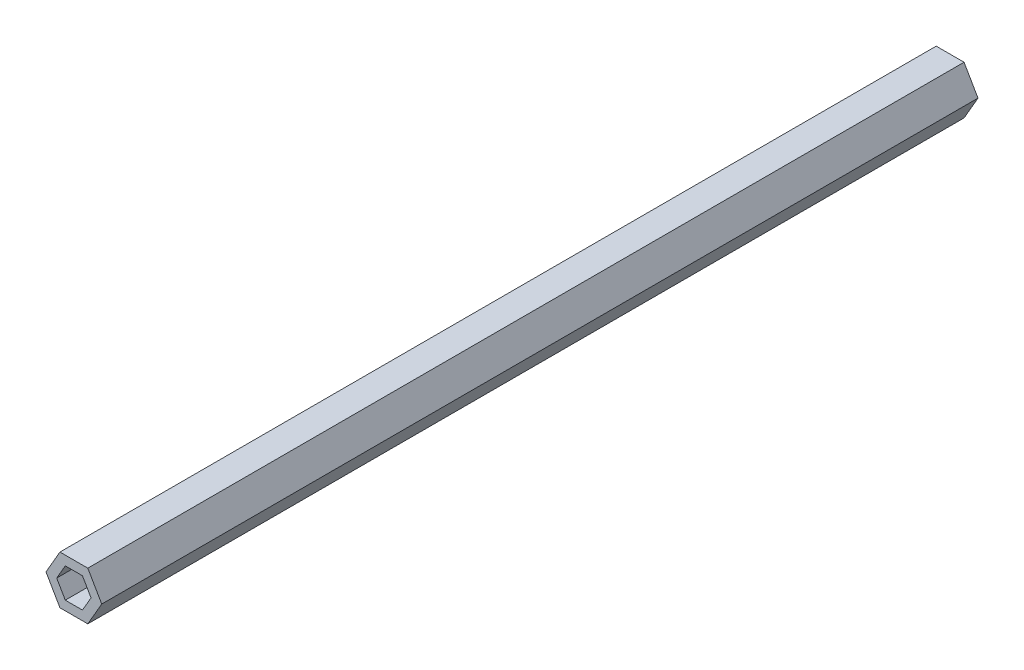
ISO-10303-21;
HEADER;
FILE_DESCRIPTION(('STEP AP214'),'2;1');
FILE_NAME('part.step','',(''),(''),'','','');
FILE_SCHEMA(('AUTOMOTIVE_DESIGN { 1 0 10303 214 1 1 1 1 }'));
ENDSEC;
DATA;
#1=APPLICATION_CONTEXT('core data for automotive mechanical design processes');
#2=APPLICATION_PROTOCOL_DEFINITION('international standard','automotive_design',2000,#1);
#3=PRODUCT_CONTEXT('',#1,'mechanical');
#4=PRODUCT('Part','Part','',(#3));
#5=PRODUCT_RELATED_PRODUCT_CATEGORY('part','',(#4));
#6=PRODUCT_DEFINITION_FORMATION('','',#4);
#7=PRODUCT_DEFINITION_CONTEXT('part definition',#1,'design');
#8=PRODUCT_DEFINITION('design','',#6,#7);
#9=PRODUCT_DEFINITION_SHAPE('','',#8);
#10=(LENGTH_UNIT() NAMED_UNIT(*) SI_UNIT(.MILLI.,.METRE.));
#11=(NAMED_UNIT(*) PLANE_ANGLE_UNIT() SI_UNIT($,.RADIAN.));
#12=(NAMED_UNIT(*) SI_UNIT($,.STERADIAN.) SOLID_ANGLE_UNIT());
#13=UNCERTAINTY_MEASURE_WITH_UNIT(LENGTH_MEASURE(1.E-05),#10,'distance_accuracy_value','');
#14=(GEOMETRIC_REPRESENTATION_CONTEXT(3) GLOBAL_UNCERTAINTY_ASSIGNED_CONTEXT((#13)) GLOBAL_UNIT_ASSIGNED_CONTEXT((#10,
#11,#12)) REPRESENTATION_CONTEXT('',''));
#15=CARTESIAN_POINT('',(0.,0.,0.));
#16=DIRECTION('',(0.,0.,1.));
#17=DIRECTION('',(1.,0.,0.));
#18=AXIS2_PLACEMENT_3D('',#15,#16,#17);
#19=CARTESIAN_POINT('',(2.8575,-4.94933518262807,179.705));
#20=DIRECTION('',(-0.866025403784439,0.5,0.));
#21=DIRECTION('',(-0.5,-0.866025403784439,0.));
#22=AXIS2_PLACEMENT_3D('',#19,#20,#21);
#23=PLANE('',#22);
#24=DIRECTION('',(0.5,0.866025403784439,0.));
#25=VECTOR('',#24,1.);
#26=CARTESIAN_POINT('',(2.8575,-4.94933518262807,0.));
#27=LINE('',#26,#25);
#28=CARTESIAN_POINT('',(2.8575,-4.94933518262807,0.));
#29=VERTEX_POINT('',#28);
#30=CARTESIAN_POINT('',(5.715,0.,0.));
#31=VERTEX_POINT('',#30);
#32=EDGE_CURVE('E298',#29,#31,#27,.T.);
#33=ORIENTED_EDGE('',*,*,#32,.T.);
#34=DIRECTION('',(0.,0.,-1.));
#35=VECTOR('',#34,1.);
#36=CARTESIAN_POINT('',(5.715,0.,179.705));
#37=LINE('',#36,#35);
#38=CARTESIAN_POINT('',(5.715,0.,179.705));
#39=VERTEX_POINT('',#38);
#40=EDGE_CURVE('E11',#39,#31,#37,.T.);
#41=ORIENTED_EDGE('',*,*,#40,.F.);
#42=DIRECTION('',(0.5,0.866025403784439,0.));
#43=VECTOR('',#42,1.);
#44=CARTESIAN_POINT('',(2.8575,-4.94933518262807,179.705));
#45=LINE('',#44,#43);
#46=CARTESIAN_POINT('',(2.8575,-4.94933518262807,179.705));
#47=VERTEX_POINT('',#46);
#48=EDGE_CURVE('E313',#47,#39,#45,.T.);
#49=ORIENTED_EDGE('',*,*,#48,.F.);
#50=DIRECTION('',(0.,0.,-1.));
#51=VECTOR('',#50,1.);
#52=CARTESIAN_POINT('',(2.8575,-4.94933518262807,179.705));
#53=LINE('',#52,#51);
#54=EDGE_CURVE('E333',#47,#29,#53,.T.);
#55=ORIENTED_EDGE('',*,*,#54,.T.);
#56=EDGE_LOOP('',(#33,#41,#49,#55));
#57=FACE_BOUND('',#56,.T.);
#58=ADVANCED_FACE('F49',(#57),#23,.F.);
#59=CARTESIAN_POINT('',(5.715,0.,179.705));
#60=DIRECTION('',(-0.866025403784438,-0.5,0.));
#61=DIRECTION('',(0.500000000000001,-0.866025403784438,0.));
#62=AXIS2_PLACEMENT_3D('',#59,#60,#61);
#63=PLANE('',#62);
#64=DIRECTION('',(-0.500000000000001,0.866025403784438,0.));
#65=VECTOR('',#64,1.);
#66=CARTESIAN_POINT('',(5.715,0.,0.));
#67=LINE('',#66,#65);
#68=CARTESIAN_POINT('',(2.8575,4.94933518262807,0.));
#69=VERTEX_POINT('',#68);
#70=EDGE_CURVE('E337',#31,#69,#67,.T.);
#71=ORIENTED_EDGE('',*,*,#70,.T.);
#72=DIRECTION('',(0.,0.,-1.));
#73=VECTOR('',#72,1.);
#74=CARTESIAN_POINT('',(2.8575,4.94933518262807,179.705));
#75=LINE('',#74,#73);
#76=CARTESIAN_POINT('',(2.8575,4.94933518262807,179.705));
#77=VERTEX_POINT('',#76);
#78=EDGE_CURVE('E57',#77,#69,#75,.T.);
#79=ORIENTED_EDGE('',*,*,#78,.F.);
#80=DIRECTION('',(-0.500000000000001,0.866025403784438,0.));
#81=VECTOR('',#80,1.);
#82=CARTESIAN_POINT('',(5.715,0.,179.705));
#83=LINE('',#82,#81);
#84=EDGE_CURVE('E317',#39,#77,#83,.T.);
#85=ORIENTED_EDGE('',*,*,#84,.F.);
#86=ORIENTED_EDGE('',*,*,#40,.T.);
#87=EDGE_LOOP('',(#71,#79,#85,#86));
#88=FACE_BOUND('',#87,.T.);
#89=ADVANCED_FACE('F394',(#88),#63,.F.);
#90=CARTESIAN_POINT('',(2.8575,4.94933518262807,179.705));
#91=DIRECTION('',(0.,-1.,0.));
#92=DIRECTION('',(1.,0.,0.));
#93=AXIS2_PLACEMENT_3D('',#90,#91,#92);
#94=PLANE('',#93);
#95=DIRECTION('',(-1.,0.,0.));
#96=VECTOR('',#95,1.);
#97=CARTESIAN_POINT('',(2.8575,4.94933518262807,0.));
#98=LINE('',#97,#96);
#99=CARTESIAN_POINT('',(-2.8575,4.94933518262807,0.));
#100=VERTEX_POINT('',#99);
#101=EDGE_CURVE('E339',#69,#100,#98,.T.);
#102=ORIENTED_EDGE('',*,*,#101,.T.);
#103=DIRECTION('',(0.,0.,-1.));
#104=VECTOR('',#103,1.);
#105=CARTESIAN_POINT('',(-2.8575,4.94933518262807,179.705));
#106=LINE('',#105,#104);
#107=CARTESIAN_POINT('',(-2.8575,4.94933518262807,179.705));
#108=VERTEX_POINT('',#107);
#109=EDGE_CURVE('E361',#108,#100,#106,.T.);
#110=ORIENTED_EDGE('',*,*,#109,.F.);
#111=DIRECTION('',(-1.,0.,0.));
#112=VECTOR('',#111,1.);
#113=CARTESIAN_POINT('',(2.8575,4.94933518262807,179.705));
#114=LINE('',#113,#112);
#115=EDGE_CURVE('E321',#77,#108,#114,.T.);
#116=ORIENTED_EDGE('',*,*,#115,.F.);
#117=ORIENTED_EDGE('',*,*,#78,.T.);
#118=EDGE_LOOP('',(#102,#110,#116,#117));
#119=FACE_BOUND('',#118,.T.);
#120=ADVANCED_FACE('F371',(#119),#94,.F.);
#121=CARTESIAN_POINT('',(-2.8575,4.94933518262807,179.705));
#122=DIRECTION('',(0.866025403784439,-0.5,0.));
#123=DIRECTION('',(0.5,0.866025403784439,0.));
#124=AXIS2_PLACEMENT_3D('',#121,#122,#123);
#125=PLANE('',#124);
#126=DIRECTION('',(-0.5,-0.866025403784439,0.));
#127=VECTOR('',#126,1.);
#128=CARTESIAN_POINT('',(-2.8575,4.94933518262807,0.));
#129=LINE('',#128,#127);
#130=CARTESIAN_POINT('',(-5.715,0.,0.));
#131=VERTEX_POINT('',#130);
#132=EDGE_CURVE('E342',#100,#131,#129,.T.);
#133=ORIENTED_EDGE('',*,*,#132,.T.);
#134=DIRECTION('',(0.,0.,-1.));
#135=VECTOR('',#134,1.);
#136=CARTESIAN_POINT('',(-5.715,0.,179.705));
#137=LINE('',#136,#135);
#138=CARTESIAN_POINT('',(-5.715,0.,179.705));
#139=VERTEX_POINT('',#138);
#140=EDGE_CURVE('E357',#139,#131,#137,.T.);
#141=ORIENTED_EDGE('',*,*,#140,.F.);
#142=DIRECTION('',(-0.5,-0.866025403784439,0.));
#143=VECTOR('',#142,1.);
#144=CARTESIAN_POINT('',(-2.8575,4.94933518262807,179.705));
#145=LINE('',#144,#143);
#146=EDGE_CURVE('E324',#108,#139,#145,.T.);
#147=ORIENTED_EDGE('',*,*,#146,.F.);
#148=ORIENTED_EDGE('',*,*,#109,.T.);
#149=EDGE_LOOP('',(#133,#141,#147,#148));
#150=FACE_BOUND('',#149,.T.);
#151=ADVANCED_FACE('F382',(#150),#125,.F.);
#152=CARTESIAN_POINT('',(-5.715,0.,179.705));
#153=DIRECTION('',(0.866025403784438,0.5,0.));
#154=DIRECTION('',(-0.5,0.866025403784439,0.));
#155=AXIS2_PLACEMENT_3D('',#152,#153,#154);
#156=PLANE('',#155);
#157=DIRECTION('',(0.5,-0.866025403784438,0.));
#158=VECTOR('',#157,1.);
#159=CARTESIAN_POINT('',(-5.715,0.,0.));
#160=LINE('',#159,#158);
#161=CARTESIAN_POINT('',(-2.8575,-4.94933518262807,0.));
#162=VERTEX_POINT('',#161);
#163=EDGE_CURVE('E345',#131,#162,#160,.T.);
#164=ORIENTED_EDGE('',*,*,#163,.T.);
#165=DIRECTION('',(0.,0.,-1.));
#166=VECTOR('',#165,1.);
#167=CARTESIAN_POINT('',(-2.8575,-4.94933518262807,179.705));
#168=LINE('',#167,#166);
#169=CARTESIAN_POINT('',(-2.8575,-4.94933518262807,179.705));
#170=VERTEX_POINT('',#169);
#171=EDGE_CURVE('E353',#170,#162,#168,.T.);
#172=ORIENTED_EDGE('',*,*,#171,.F.);
#173=DIRECTION('',(0.5,-0.866025403784438,0.));
#174=VECTOR('',#173,1.);
#175=CARTESIAN_POINT('',(-5.715,0.,179.705));
#176=LINE('',#175,#174);
#177=EDGE_CURVE('E327',#139,#170,#176,.T.);
#178=ORIENTED_EDGE('',*,*,#177,.F.);
#179=ORIENTED_EDGE('',*,*,#140,.T.);
#180=EDGE_LOOP('',(#164,#172,#178,#179));
#181=FACE_BOUND('',#180,.T.);
#182=ADVANCED_FACE('F386',(#181),#156,.F.);
#183=CARTESIAN_POINT('',(-2.8575,-4.94933518262807,179.705));
#184=DIRECTION('',(0.,1.,0.));
#185=DIRECTION('',(-1.,0.,0.));
#186=AXIS2_PLACEMENT_3D('',#183,#184,#185);
#187=PLANE('',#186);
#188=DIRECTION('',(1.,0.,0.));
#189=VECTOR('',#188,1.);
#190=CARTESIAN_POINT('',(-2.8575,-4.94933518262807,0.));
#191=LINE('',#190,#189);
#192=EDGE_CURVE('E318',#162,#29,#191,.T.);
#193=ORIENTED_EDGE('',*,*,#192,.T.);
#194=ORIENTED_EDGE('',*,*,#54,.F.);
#195=DIRECTION('',(1.,0.,0.));
#196=VECTOR('',#195,1.);
#197=CARTESIAN_POINT('',(-2.8575,-4.94933518262807,179.705));
#198=LINE('',#197,#196);
#199=EDGE_CURVE('E330',#170,#47,#198,.T.);
#200=ORIENTED_EDGE('',*,*,#199,.F.);
#201=ORIENTED_EDGE('',*,*,#171,.T.);
#202=EDGE_LOOP('',(#193,#194,#200,#201));
#203=FACE_BOUND('',#202,.T.);
#204=ADVANCED_FACE('F397',(#203),#187,.F.);
#205=CARTESIAN_POINT('',(0.,0.,179.705));
#206=DIRECTION('',(0.,0.,1.));
#207=DIRECTION('',(1.,0.,0.));
#208=AXIS2_PLACEMENT_3D('',#205,#206,#207);
#209=PLANE('',#208);
#210=DIRECTION('',(0.5,0.866025403784439,0.));
#211=VECTOR('',#210,1.);
#212=CARTESIAN_POINT('',(1.76091831871896,-3.049999996,179.705));
#213=LINE('',#212,#211);
#214=CARTESIAN_POINT('',(1.76091831871896,-3.049999996,179.705));
#215=VERTEX_POINT('',#214);
#216=CARTESIAN_POINT('',(3.52183663743792,0.,179.705));
#217=VERTEX_POINT('',#216);
#218=EDGE_CURVE('E72',#215,#217,#213,.T.);
#219=ORIENTED_EDGE('',*,*,#218,.F.);
#220=DIRECTION('',(1.,0.,0.));
#221=VECTOR('',#220,1.);
#222=CARTESIAN_POINT('',(-1.76091831871896,-3.049999996,179.705));
#223=LINE('',#222,#221);
#224=CARTESIAN_POINT('',(-1.76091831871896,-3.049999996,179.705));
#225=VERTEX_POINT('',#224);
#226=EDGE_CURVE('E254',#225,#215,#223,.T.);
#227=ORIENTED_EDGE('',*,*,#226,.F.);
#228=DIRECTION('',(0.5,-0.866025403784438,0.));
#229=VECTOR('',#228,1.);
#230=CARTESIAN_POINT('',(-3.52183663743791,0.,179.705));
#231=LINE('',#230,#229);
#232=CARTESIAN_POINT('',(-3.52183663743791,0.,179.705));
#233=VERTEX_POINT('',#232);
#234=EDGE_CURVE('E289',#233,#225,#231,.T.);
#235=ORIENTED_EDGE('',*,*,#234,.F.);
#236=DIRECTION('',(-0.5,-0.866025403784439,0.));
#237=VECTOR('',#236,1.);
#238=CARTESIAN_POINT('',(-1.76091831871896,3.049999996,179.705));
#239=LINE('',#238,#237);
#240=CARTESIAN_POINT('',(-1.76091831871896,3.049999996,179.705));
#241=VERTEX_POINT('',#240);
#242=EDGE_CURVE('E285',#241,#233,#239,.T.);
#243=ORIENTED_EDGE('',*,*,#242,.F.);
#244=DIRECTION('',(-1.,0.,0.));
#245=VECTOR('',#244,1.);
#246=CARTESIAN_POINT('',(1.76091831871896,3.049999996,179.705));
#247=LINE('',#246,#245);
#248=CARTESIAN_POINT('',(1.76091831871896,3.049999996,179.705));
#249=VERTEX_POINT('',#248);
#250=EDGE_CURVE('E281',#249,#241,#247,.T.);
#251=ORIENTED_EDGE('',*,*,#250,.F.);
#252=DIRECTION('',(-0.5,0.866025403784438,0.));
#253=VECTOR('',#252,1.);
#254=CARTESIAN_POINT('',(3.52183663743792,0.,179.705));
#255=LINE('',#254,#253);
#256=EDGE_CURVE('E277',#217,#249,#255,.T.);
#257=ORIENTED_EDGE('',*,*,#256,.F.);
#258=EDGE_LOOP('',(#219,#227,#235,#243,#251,#257));
#259=FACE_BOUND('',#258,.T.);
#260=ORIENTED_EDGE('',*,*,#48,.T.);
#261=ORIENTED_EDGE('',*,*,#84,.T.);
#262=ORIENTED_EDGE('',*,*,#115,.T.);
#263=ORIENTED_EDGE('',*,*,#146,.T.);
#264=ORIENTED_EDGE('',*,*,#177,.T.);
#265=ORIENTED_EDGE('',*,*,#199,.T.);
#266=EDGE_LOOP('',(#260,#261,#262,#263,#264,#265));
#267=FACE_BOUND('',#266,.T.);
#268=ADVANCED_FACE('F390',(#259,#267),#209,.T.);
#269=CARTESIAN_POINT('',(0.,0.,0.));
#270=DIRECTION('',(0.,0.,1.));
#271=DIRECTION('',(1.,0.,0.));
#272=AXIS2_PLACEMENT_3D('',#269,#270,#271);
#273=PLANE('',#272);
#274=DIRECTION('',(1.,0.,0.));
#275=VECTOR('',#274,1.);
#276=CARTESIAN_POINT('',(-1.76091831871896,3.049999996,0.));
#277=LINE('',#276,#275);
#278=CARTESIAN_POINT('',(-1.76091831871896,3.049999996,0.));
#279=VERTEX_POINT('',#278);
#280=CARTESIAN_POINT('',(1.76091831871896,3.049999996,0.));
#281=VERTEX_POINT('',#280);
#282=EDGE_CURVE('E221',#279,#281,#277,.T.);
#283=ORIENTED_EDGE('',*,*,#282,.F.);
#284=DIRECTION('',(0.5,0.866025403784438,0.));
#285=VECTOR('',#284,1.);
#286=CARTESIAN_POINT('',(-3.52183663743791,0.,0.));
#287=LINE('',#286,#285);
#288=CARTESIAN_POINT('',(-3.52183663743791,0.,0.));
#289=VERTEX_POINT('',#288);
#290=EDGE_CURVE('E64',#289,#279,#287,.T.);
#291=ORIENTED_EDGE('',*,*,#290,.F.);
#292=DIRECTION('',(-0.5,0.866025403784438,0.));
#293=VECTOR('',#292,1.);
#294=CARTESIAN_POINT('',(-1.76091831871896,-3.049999996,0.));
#295=LINE('',#294,#293);
#296=CARTESIAN_POINT('',(-1.76091831871896,-3.049999996,0.));
#297=VERTEX_POINT('',#296);
#298=EDGE_CURVE('E198',#297,#289,#295,.T.);
#299=ORIENTED_EDGE('',*,*,#298,.F.);
#300=DIRECTION('',(-1.,0.,0.));
#301=VECTOR('',#300,1.);
#302=CARTESIAN_POINT('',(1.76091831871896,-3.049999996,0.));
#303=LINE('',#302,#301);
#304=CARTESIAN_POINT('',(1.76091831871896,-3.049999996,0.));
#305=VERTEX_POINT('',#304);
#306=EDGE_CURVE('E205',#305,#297,#303,.T.);
#307=ORIENTED_EDGE('',*,*,#306,.F.);
#308=DIRECTION('',(-0.5,-0.866025403784438,0.));
#309=VECTOR('',#308,1.);
#310=CARTESIAN_POINT('',(3.52183663743791,0.,0.));
#311=LINE('',#310,#309);
#312=CARTESIAN_POINT('',(3.52183663743791,0.,0.));
#313=VERTEX_POINT('',#312);
#314=EDGE_CURVE('E228',#313,#305,#311,.T.);
#315=ORIENTED_EDGE('',*,*,#314,.F.);
#316=DIRECTION('',(0.5,-0.866025403784439,0.));
#317=VECTOR('',#316,1.);
#318=CARTESIAN_POINT('',(1.76091831871896,3.049999996,0.));
#319=LINE('',#318,#317);
#320=EDGE_CURVE('E224',#281,#313,#319,.T.);
#321=ORIENTED_EDGE('',*,*,#320,.F.);
#322=EDGE_LOOP('',(#283,#291,#299,#307,#315,#321));
#323=FACE_BOUND('',#322,.T.);
#324=ORIENTED_EDGE('',*,*,#32,.F.);
#325=ORIENTED_EDGE('',*,*,#192,.F.);
#326=ORIENTED_EDGE('',*,*,#163,.F.);
#327=ORIENTED_EDGE('',*,*,#132,.F.);
#328=ORIENTED_EDGE('',*,*,#101,.F.);
#329=ORIENTED_EDGE('',*,*,#70,.F.);
#330=EDGE_LOOP('',(#324,#325,#326,#327,#328,#329));
#331=FACE_BOUND('',#330,.T.);
#332=ADVANCED_FACE('F377',(#323,#331),#273,.F.);
#333=CARTESIAN_POINT('',(1.76091831871896,-3.049999996,173.355));
#334=DIRECTION('',(0.866025403784439,-0.5,0.));
#335=DIRECTION('',(0.5,0.866025403784439,0.));
#336=AXIS2_PLACEMENT_3D('',#333,#334,#335);
#337=PLANE('',#336);
#338=ORIENTED_EDGE('',*,*,#218,.T.);
#339=DIRECTION('',(0.,0.,1.));
#340=VECTOR('',#339,1.);
#341=CARTESIAN_POINT('',(3.52183663743792,0.,173.355));
#342=LINE('',#341,#340);
#343=CARTESIAN_POINT('',(3.52183663743792,0.,173.355));
#344=VERTEX_POINT('',#343);
#345=EDGE_CURVE('E274',#344,#217,#342,.T.);
#346=ORIENTED_EDGE('',*,*,#345,.F.);
#347=DIRECTION('',(0.5,0.866025403784439,0.));
#348=VECTOR('',#347,1.);
#349=CARTESIAN_POINT('',(1.76091831871896,-3.049999996,173.355));
#350=LINE('',#349,#348);
#351=CARTESIAN_POINT('',(1.76091831871896,-3.049999996,173.355));
#352=VERTEX_POINT('',#351);
#353=EDGE_CURVE('E249',#352,#344,#350,.T.);
#354=ORIENTED_EDGE('',*,*,#353,.F.);
#355=DIRECTION('',(0.,0.,1.));
#356=VECTOR('',#355,1.);
#357=CARTESIAN_POINT('',(1.76091831871896,-3.049999996,173.355));
#358=LINE('',#357,#356);
#359=EDGE_CURVE('E295',#352,#215,#358,.T.);
#360=ORIENTED_EDGE('',*,*,#359,.T.);
#361=EDGE_LOOP('',(#338,#346,#354,#360));
#362=FACE_BOUND('',#361,.T.);
#363=ADVANCED_FACE('F439',(#362),#337,.F.);
#364=CARTESIAN_POINT('',(-1.76091831871896,-3.049999996,173.355));
#365=DIRECTION('',(0.,-1.,0.));
#366=DIRECTION('',(0.,0.,-1.));
#367=AXIS2_PLACEMENT_3D('',#364,#365,#366);
#368=PLANE('',#367);
#369=ORIENTED_EDGE('',*,*,#226,.T.);
#370=ORIENTED_EDGE('',*,*,#359,.F.);
#371=DIRECTION('',(1.,0.,0.));
#372=VECTOR('',#371,1.);
#373=CARTESIAN_POINT('',(-1.76091831871896,-3.049999996,173.355));
#374=LINE('',#373,#372);
#375=CARTESIAN_POINT('',(-1.76091831871896,-3.049999996,173.355));
#376=VERTEX_POINT('',#375);
#377=EDGE_CURVE('E270',#376,#352,#374,.T.);
#378=ORIENTED_EDGE('',*,*,#377,.F.);
#379=DIRECTION('',(0.,0.,1.));
#380=VECTOR('',#379,1.);
#381=CARTESIAN_POINT('',(-1.76091831871896,-3.049999996,173.355));
#382=LINE('',#381,#380);
#383=EDGE_CURVE('E299',#376,#225,#382,.T.);
#384=ORIENTED_EDGE('',*,*,#383,.T.);
#385=EDGE_LOOP('',(#369,#370,#378,#384));
#386=FACE_BOUND('',#385,.T.);
#387=ADVANCED_FACE('F444',(#386),#368,.F.);
#388=CARTESIAN_POINT('',(-3.52183663743791,0.,173.355));
#389=DIRECTION('',(-0.866025403784438,-0.5,0.));
#390=DIRECTION('',(0.5,-0.866025403784439,0.));
#391=AXIS2_PLACEMENT_3D('',#388,#389,#390);
#392=PLANE('',#391);
#393=ORIENTED_EDGE('',*,*,#234,.T.);
#394=ORIENTED_EDGE('',*,*,#383,.F.);
#395=DIRECTION('',(0.5,-0.866025403784438,0.));
#396=VECTOR('',#395,1.);
#397=CARTESIAN_POINT('',(-3.52183663743791,0.,173.355));
#398=LINE('',#397,#396);
#399=CARTESIAN_POINT('',(-3.52183663743791,0.,173.355));
#400=VERTEX_POINT('',#399);
#401=EDGE_CURVE('E266',#400,#376,#398,.T.);
#402=ORIENTED_EDGE('',*,*,#401,.F.);
#403=DIRECTION('',(0.,0.,1.));
#404=VECTOR('',#403,1.);
#405=CARTESIAN_POINT('',(-3.52183663743791,0.,173.355));
#406=LINE('',#405,#404);
#407=EDGE_CURVE('E302',#400,#233,#406,.T.);
#408=ORIENTED_EDGE('',*,*,#407,.T.);
#409=EDGE_LOOP('',(#393,#394,#402,#408));
#410=FACE_BOUND('',#409,.T.);
#411=ADVANCED_FACE('F453',(#410),#392,.F.);
#412=CARTESIAN_POINT('',(-1.76091831871896,3.049999996,173.355));
#413=DIRECTION('',(-0.866025403784439,0.5,0.));
#414=DIRECTION('',(-0.5,-0.866025403784439,0.));
#415=AXIS2_PLACEMENT_3D('',#412,#413,#414);
#416=PLANE('',#415);
#417=ORIENTED_EDGE('',*,*,#242,.T.);
#418=ORIENTED_EDGE('',*,*,#407,.F.);
#419=DIRECTION('',(-0.5,-0.866025403784439,0.));
#420=VECTOR('',#419,1.);
#421=CARTESIAN_POINT('',(-1.76091831871896,3.049999996,173.355));
#422=LINE('',#421,#420);
#423=CARTESIAN_POINT('',(-1.76091831871896,3.049999996,173.355));
#424=VERTEX_POINT('',#423);
#425=EDGE_CURVE('E262',#424,#400,#422,.T.);
#426=ORIENTED_EDGE('',*,*,#425,.F.);
#427=DIRECTION('',(0.,0.,1.));
#428=VECTOR('',#427,1.);
#429=CARTESIAN_POINT('',(-1.76091831871896,3.049999996,173.355));
#430=LINE('',#429,#428);
#431=EDGE_CURVE('E305',#424,#241,#430,.T.);
#432=ORIENTED_EDGE('',*,*,#431,.T.);
#433=EDGE_LOOP('',(#417,#418,#426,#432));
#434=FACE_BOUND('',#433,.T.);
#435=ADVANCED_FACE('F463',(#434),#416,.F.);
#436=CARTESIAN_POINT('',(1.76091831871896,3.049999996,173.355));
#437=DIRECTION('',(0.,1.,0.));
#438=DIRECTION('',(0.,0.,1.));
#439=AXIS2_PLACEMENT_3D('',#436,#437,#438);
#440=PLANE('',#439);
#441=ORIENTED_EDGE('',*,*,#250,.T.);
#442=ORIENTED_EDGE('',*,*,#431,.F.);
#443=DIRECTION('',(-1.,0.,0.));
#444=VECTOR('',#443,1.);
#445=CARTESIAN_POINT('',(1.76091831871896,3.049999996,173.355));
#446=LINE('',#445,#444);
#447=CARTESIAN_POINT('',(1.76091831871896,3.049999996,173.355));
#448=VERTEX_POINT('',#447);
#449=EDGE_CURVE('E258',#448,#424,#446,.T.);
#450=ORIENTED_EDGE('',*,*,#449,.F.);
#451=DIRECTION('',(0.,0.,1.));
#452=VECTOR('',#451,1.);
#453=CARTESIAN_POINT('',(1.76091831871896,3.049999996,173.355));
#454=LINE('',#453,#452);
#455=EDGE_CURVE('E308',#448,#249,#454,.T.);
#456=ORIENTED_EDGE('',*,*,#455,.T.);
#457=EDGE_LOOP('',(#441,#442,#450,#456));
#458=FACE_BOUND('',#457,.T.);
#459=ADVANCED_FACE('F473',(#458),#440,.F.);
#460=CARTESIAN_POINT('',(3.52183663743792,0.,173.355));
#461=DIRECTION('',(0.866025403784438,0.5,0.));
#462=DIRECTION('',(-0.5,0.866025403784438,0.));
#463=AXIS2_PLACEMENT_3D('',#460,#461,#462);
#464=PLANE('',#463);
#465=ORIENTED_EDGE('',*,*,#256,.T.);
#466=ORIENTED_EDGE('',*,*,#455,.F.);
#467=DIRECTION('',(-0.5,0.866025403784438,0.));
#468=VECTOR('',#467,1.);
#469=CARTESIAN_POINT('',(3.52183663743792,0.,173.355));
#470=LINE('',#469,#468);
#471=EDGE_CURVE('E253',#344,#448,#470,.T.);
#472=ORIENTED_EDGE('',*,*,#471,.F.);
#473=ORIENTED_EDGE('',*,*,#345,.T.);
#474=EDGE_LOOP('',(#465,#466,#472,#473));
#475=FACE_BOUND('',#474,.T.);
#476=ADVANCED_FACE('F483',(#475),#464,.F.);
#477=CARTESIAN_POINT('',(0.,0.,173.355));
#478=DIRECTION('',(0.,0.,1.));
#479=DIRECTION('',(1.,0.,0.));
#480=AXIS2_PLACEMENT_3D('',#477,#478,#479);
#481=PLANE('',#480);
#482=ORIENTED_EDGE('',*,*,#353,.T.);
#483=ORIENTED_EDGE('',*,*,#471,.T.);
#484=ORIENTED_EDGE('',*,*,#449,.T.);
#485=ORIENTED_EDGE('',*,*,#425,.T.);
#486=ORIENTED_EDGE('',*,*,#401,.T.);
#487=ORIENTED_EDGE('',*,*,#377,.T.);
#488=EDGE_LOOP('',(#482,#483,#484,#485,#486,#487));
#489=FACE_BOUND('',#488,.T.);
#490=ADVANCED_FACE('F493',(#489),#481,.T.);
#491=CARTESIAN_POINT('',(-3.52183663743791,0.,6.35));
#492=DIRECTION('',(-0.866025403784438,0.5,0.));
#493=DIRECTION('',(-0.5,-0.866025403784439,0.));
#494=AXIS2_PLACEMENT_3D('',#491,#492,#493);
#495=PLANE('',#494);
#496=ORIENTED_EDGE('',*,*,#290,.T.);
#497=DIRECTION('',(0.,0.,-1.));
#498=VECTOR('',#497,1.);
#499=CARTESIAN_POINT('',(-1.76091831871896,3.049999996,6.35));
#500=LINE('',#499,#498);
#501=CARTESIAN_POINT('',(-1.76091831871896,3.049999996,6.35));
#502=VERTEX_POINT('',#501);
#503=EDGE_CURVE('E172',#502,#279,#500,.T.);
#504=ORIENTED_EDGE('',*,*,#503,.F.);
#505=DIRECTION('',(0.5,0.866025403784438,0.));
#506=VECTOR('',#505,1.);
#507=CARTESIAN_POINT('',(-3.52183663743791,0.,6.35));
#508=LINE('',#507,#506);
#509=CARTESIAN_POINT('',(-3.52183663743791,0.,6.35));
#510=VERTEX_POINT('',#509);
#511=EDGE_CURVE('E176',#510,#502,#508,.T.);
#512=ORIENTED_EDGE('',*,*,#511,.F.);
#513=DIRECTION('',(0.,0.,-1.));
#514=VECTOR('',#513,1.);
#515=CARTESIAN_POINT('',(-3.52183663743791,0.,6.35));
#516=LINE('',#515,#514);
#517=EDGE_CURVE('E235',#510,#289,#516,.T.);
#518=ORIENTED_EDGE('',*,*,#517,.T.);
#519=EDGE_LOOP('',(#496,#504,#512,#518));
#520=FACE_BOUND('',#519,.T.);
#521=ADVANCED_FACE('F174',(#520),#495,.F.);
#522=CARTESIAN_POINT('',(-1.76091831871896,-3.049999996,6.35));
#523=DIRECTION('',(-0.866025403784438,-0.5,0.));
#524=DIRECTION('',(0.5,-0.866025403784439,0.));
#525=AXIS2_PLACEMENT_3D('',#522,#523,#524);
#526=PLANE('',#525);
#527=ORIENTED_EDGE('',*,*,#298,.T.);
#528=ORIENTED_EDGE('',*,*,#517,.F.);
#529=DIRECTION('',(-0.5,0.866025403784438,0.));
#530=VECTOR('',#529,1.);
#531=CARTESIAN_POINT('',(-1.76091831871896,-3.049999996,6.35));
#532=LINE('',#531,#530);
#533=CARTESIAN_POINT('',(-1.76091831871896,-3.049999996,6.35));
#534=VERTEX_POINT('',#533);
#535=EDGE_CURVE('E183',#534,#510,#532,.T.);
#536=ORIENTED_EDGE('',*,*,#535,.F.);
#537=DIRECTION('',(0.,0.,-1.));
#538=VECTOR('',#537,1.);
#539=CARTESIAN_POINT('',(-1.76091831871896,-3.049999996,6.35));
#540=LINE('',#539,#538);
#541=EDGE_CURVE('E238',#534,#297,#540,.T.);
#542=ORIENTED_EDGE('',*,*,#541,.T.);
#543=EDGE_LOOP('',(#527,#528,#536,#542));
#544=FACE_BOUND('',#543,.T.);
#545=ADVANCED_FACE('F518',(#544),#526,.F.);
#546=CARTESIAN_POINT('',(1.76091831871896,-3.049999996,6.35));
#547=DIRECTION('',(0.,-1.,0.));
#548=DIRECTION('',(0.,0.,-1.));
#549=AXIS2_PLACEMENT_3D('',#546,#547,#548);
#550=PLANE('',#549);
#551=ORIENTED_EDGE('',*,*,#306,.T.);
#552=ORIENTED_EDGE('',*,*,#541,.F.);
#553=DIRECTION('',(-1.,0.,0.));
#554=VECTOR('',#553,1.);
#555=CARTESIAN_POINT('',(1.76091831871896,-3.049999996,6.35));
#556=LINE('',#555,#554);
#557=CARTESIAN_POINT('',(1.76091831871896,-3.049999996,6.35));
#558=VERTEX_POINT('',#557);
#559=EDGE_CURVE('E214',#558,#534,#556,.T.);
#560=ORIENTED_EDGE('',*,*,#559,.F.);
#561=DIRECTION('',(0.,0.,-1.));
#562=VECTOR('',#561,1.);
#563=CARTESIAN_POINT('',(1.76091831871896,-3.049999996,6.35));
#564=LINE('',#563,#562);
#565=EDGE_CURVE('E241',#558,#305,#564,.T.);
#566=ORIENTED_EDGE('',*,*,#565,.T.);
#567=EDGE_LOOP('',(#551,#552,#560,#566));
#568=FACE_BOUND('',#567,.T.);
#569=ADVANCED_FACE('F527',(#568),#550,.F.);
#570=CARTESIAN_POINT('',(3.52183663743791,0.,6.35));
#571=DIRECTION('',(0.866025403784438,-0.5,0.));
#572=DIRECTION('',(0.5,0.866025403784439,0.));
#573=AXIS2_PLACEMENT_3D('',#570,#571,#572);
#574=PLANE('',#573);
#575=ORIENTED_EDGE('',*,*,#314,.T.);
#576=ORIENTED_EDGE('',*,*,#565,.F.);
#577=DIRECTION('',(-0.5,-0.866025403784438,0.));
#578=VECTOR('',#577,1.);
#579=CARTESIAN_POINT('',(3.52183663743791,0.,6.35));
#580=LINE('',#579,#578);
#581=CARTESIAN_POINT('',(3.52183663743791,0.,6.35));
#582=VERTEX_POINT('',#581);
#583=EDGE_CURVE('E210',#582,#558,#580,.T.);
#584=ORIENTED_EDGE('',*,*,#583,.F.);
#585=DIRECTION('',(0.,0.,-1.));
#586=VECTOR('',#585,1.);
#587=CARTESIAN_POINT('',(3.52183663743791,0.,6.35));
#588=LINE('',#587,#586);
#589=EDGE_CURVE('E244',#582,#313,#588,.T.);
#590=ORIENTED_EDGE('',*,*,#589,.T.);
#591=EDGE_LOOP('',(#575,#576,#584,#590));
#592=FACE_BOUND('',#591,.T.);
#593=ADVANCED_FACE('F537',(#592),#574,.F.);
#594=CARTESIAN_POINT('',(1.76091831871896,3.049999996,6.35));
#595=DIRECTION('',(0.866025403784439,0.5,0.));
#596=DIRECTION('',(-0.5,0.866025403784439,0.));
#597=AXIS2_PLACEMENT_3D('',#594,#595,#596);
#598=PLANE('',#597);
#599=ORIENTED_EDGE('',*,*,#320,.T.);
#600=ORIENTED_EDGE('',*,*,#589,.F.);
#601=DIRECTION('',(0.5,-0.866025403784439,0.));
#602=VECTOR('',#601,1.);
#603=CARTESIAN_POINT('',(1.76091831871896,3.049999996,6.35));
#604=LINE('',#603,#602);
#605=CARTESIAN_POINT('',(1.76091831871896,3.049999996,6.35));
#606=VERTEX_POINT('',#605);
#607=EDGE_CURVE('E192',#606,#582,#604,.T.);
#608=ORIENTED_EDGE('',*,*,#607,.F.);
#609=DIRECTION('',(0.,0.,-1.));
#610=VECTOR('',#609,1.);
#611=CARTESIAN_POINT('',(1.76091831871896,3.049999996,6.35));
#612=LINE('',#611,#610);
#613=EDGE_CURVE('E182',#606,#281,#612,.T.);
#614=ORIENTED_EDGE('',*,*,#613,.T.);
#615=EDGE_LOOP('',(#599,#600,#608,#614));
#616=FACE_BOUND('',#615,.T.);
#617=ADVANCED_FACE('F547',(#616),#598,.F.);
#618=CARTESIAN_POINT('',(-1.76091831871896,3.049999996,6.35));
#619=DIRECTION('',(0.,1.,0.));
#620=DIRECTION('',(0.,0.,1.));
#621=AXIS2_PLACEMENT_3D('',#618,#619,#620);
#622=PLANE('',#621);
#623=ORIENTED_EDGE('',*,*,#282,.T.);
#624=ORIENTED_EDGE('',*,*,#613,.F.);
#625=DIRECTION('',(1.,0.,0.));
#626=VECTOR('',#625,1.);
#627=CARTESIAN_POINT('',(-1.76091831871896,3.049999996,6.35));
#628=LINE('',#627,#626);
#629=EDGE_CURVE('E186',#502,#606,#628,.T.);
#630=ORIENTED_EDGE('',*,*,#629,.F.);
#631=ORIENTED_EDGE('',*,*,#503,.T.);
#632=EDGE_LOOP('',(#623,#624,#630,#631));
#633=FACE_BOUND('',#632,.T.);
#634=ADVANCED_FACE('F187',(#633),#622,.F.);
#635=CARTESIAN_POINT('',(0.,0.,6.35));
#636=DIRECTION('',(0.,0.,-1.));
#637=DIRECTION('',(-1.,0.,0.));
#638=AXIS2_PLACEMENT_3D('',#635,#636,#637);
#639=PLANE('',#638);
#640=ORIENTED_EDGE('',*,*,#511,.T.);
#641=ORIENTED_EDGE('',*,*,#629,.T.);
#642=ORIENTED_EDGE('',*,*,#607,.T.);
#643=ORIENTED_EDGE('',*,*,#583,.T.);
#644=ORIENTED_EDGE('',*,*,#559,.T.);
#645=ORIENTED_EDGE('',*,*,#535,.T.);
#646=EDGE_LOOP('',(#640,#641,#642,#643,#644,#645));
#647=FACE_BOUND('',#646,.T.);
#648=ADVANCED_FACE('F194',(#647),#639,.T.);
#649=CLOSED_SHELL('',(#58,#89,#120,#151,#182,#204,#268,#332,#363,#387,#411,#435,#459,#476,#490,
#521,#545,#569,#593,#617,#634,#648));
#650=MANIFOLD_SOLID_BREP('B2',#649);
#651=ADVANCED_BREP_SHAPE_REPRESENTATION('',(#18,#650),#14);
#652=SHAPE_DEFINITION_REPRESENTATION(#9,#651);
ENDSEC;
END-ISO-10303-21;
